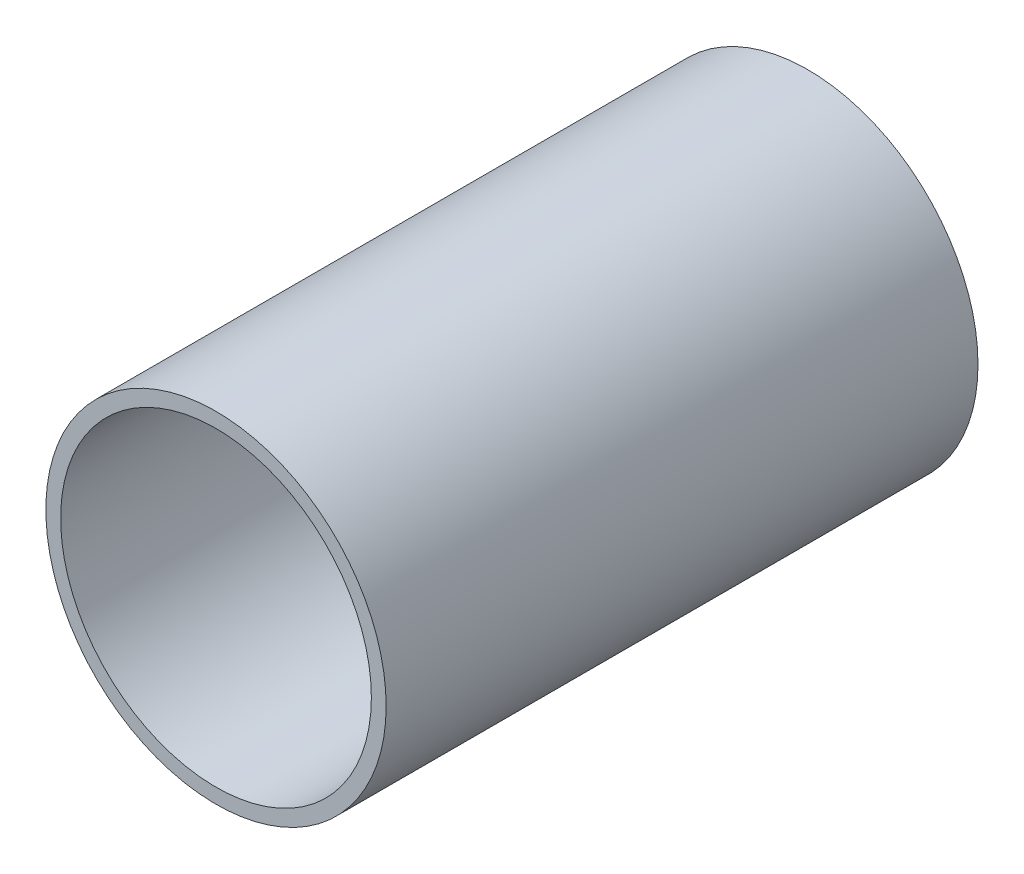
ISO-10303-21;
HEADER;
FILE_DESCRIPTION(('STEP AP214'),'2;1');
FILE_NAME('part.step','',(''),(''),'','','');
FILE_SCHEMA(('AUTOMOTIVE_DESIGN { 1 0 10303 214 1 1 1 1 }'));
ENDSEC;
DATA;
#1=APPLICATION_CONTEXT('core data for automotive mechanical design processes');
#2=APPLICATION_PROTOCOL_DEFINITION('international standard','automotive_design',2000,#1);
#3=PRODUCT_CONTEXT('',#1,'mechanical');
#4=PRODUCT('Part','Part','',(#3));
#5=PRODUCT_RELATED_PRODUCT_CATEGORY('part','',(#4));
#6=PRODUCT_DEFINITION_FORMATION('','',#4);
#7=PRODUCT_DEFINITION_CONTEXT('part definition',#1,'design');
#8=PRODUCT_DEFINITION('design','',#6,#7);
#9=PRODUCT_DEFINITION_SHAPE('','',#8);
#10=(LENGTH_UNIT() NAMED_UNIT(*) SI_UNIT(.MILLI.,.METRE.));
#11=(NAMED_UNIT(*) PLANE_ANGLE_UNIT() SI_UNIT($,.RADIAN.));
#12=(NAMED_UNIT(*) SI_UNIT($,.STERADIAN.) SOLID_ANGLE_UNIT());
#13=UNCERTAINTY_MEASURE_WITH_UNIT(LENGTH_MEASURE(1.E-05),#10,'distance_accuracy_value','');
#14=(GEOMETRIC_REPRESENTATION_CONTEXT(3) GLOBAL_UNCERTAINTY_ASSIGNED_CONTEXT((#13)) GLOBAL_UNIT_ASSIGNED_CONTEXT((#10,
#11,#12)) REPRESENTATION_CONTEXT('',''));
#15=CARTESIAN_POINT('',(0.,0.,0.));
#16=DIRECTION('',(0.,0.,1.));
#17=DIRECTION('',(1.,0.,0.));
#18=AXIS2_PLACEMENT_3D('',#15,#16,#17);
#19=CARTESIAN_POINT('',(0.,0.,50.8));
#20=DIRECTION('',(0.,0.,1.));
#21=DIRECTION('',(1.,0.,0.));
#22=AXIS2_PLACEMENT_3D('',#19,#20,#21);
#23=PLANE('',#22);
#24=CARTESIAN_POINT('',(0.,0.,50.8));
#25=DIRECTION('',(0.,0.,1.));
#26=DIRECTION('',(1.,0.,0.));
#27=AXIS2_PLACEMENT_3D('',#24,#25,#26);
#28=CIRCLE('',#27,29.21);
#29=CARTESIAN_POINT('',(29.21,0.,50.8));
#30=VERTEX_POINT('',#29);
#31=EDGE_CURVE('E10',#30,#30,#28,.T.);
#32=ORIENTED_EDGE('',*,*,#31,.T.);
#33=EDGE_LOOP('',(#32));
#34=FACE_BOUND('',#33,.T.);
#35=CARTESIAN_POINT('',(0.,0.,50.8));
#36=DIRECTION('',(0.,0.,1.));
#37=DIRECTION('',(1.,0.,0.));
#38=AXIS2_PLACEMENT_3D('',#35,#36,#37);
#39=CIRCLE('',#38,26.67);
#40=CARTESIAN_POINT('',(26.67,0.,50.8));
#41=VERTEX_POINT('',#40);
#42=EDGE_CURVE('E53',#41,#41,#39,.T.);
#43=ORIENTED_EDGE('',*,*,#42,.F.);
#44=EDGE_LOOP('',(#43));
#45=FACE_BOUND('',#44,.T.);
#46=ADVANCED_FACE('F39',(#34,#45),#23,.T.);
#47=CARTESIAN_POINT('',(0.,0.,-50.8));
#48=DIRECTION('',(0.,0.,1.));
#49=DIRECTION('',(1.,0.,0.));
#50=AXIS2_PLACEMENT_3D('',#47,#48,#49);
#51=PLANE('',#50);
#52=CARTESIAN_POINT('',(0.,0.,-50.8));
#53=DIRECTION('',(0.,0.,1.));
#54=DIRECTION('',(1.,0.,0.));
#55=AXIS2_PLACEMENT_3D('',#52,#53,#54);
#56=CIRCLE('',#55,29.21);
#57=CARTESIAN_POINT('',(29.21,0.,-50.8));
#58=VERTEX_POINT('',#57);
#59=EDGE_CURVE('E43',#58,#58,#56,.T.);
#60=ORIENTED_EDGE('',*,*,#59,.F.);
#61=EDGE_LOOP('',(#60));
#62=FACE_BOUND('',#61,.T.);
#63=CARTESIAN_POINT('',(0.,0.,-50.8));
#64=DIRECTION('',(0.,0.,1.));
#65=DIRECTION('',(1.,0.,0.));
#66=AXIS2_PLACEMENT_3D('',#63,#64,#65);
#67=CIRCLE('',#66,26.67);
#68=CARTESIAN_POINT('',(26.67,0.,-50.8));
#69=VERTEX_POINT('',#68);
#70=EDGE_CURVE('E55',#69,#69,#67,.T.);
#71=ORIENTED_EDGE('',*,*,#70,.T.);
#72=EDGE_LOOP('',(#71));
#73=FACE_BOUND('',#72,.T.);
#74=ADVANCED_FACE('F68',(#62,#73),#51,.F.);
#75=CARTESIAN_POINT('',(0.,0.,50.8));
#76=DIRECTION('',(0.,0.,-1.));
#77=DIRECTION('',(-1.,0.,0.));
#78=AXIS2_PLACEMENT_3D('',#75,#76,#77);
#79=CYLINDRICAL_SURFACE('',#78,29.21);
#80=ORIENTED_EDGE('',*,*,#31,.F.);
#81=EDGE_LOOP('',(#80));
#82=FACE_BOUND('',#81,.T.);
#83=ORIENTED_EDGE('',*,*,#59,.T.);
#84=EDGE_LOOP('',(#83));
#85=FACE_BOUND('',#84,.T.);
#86=ADVANCED_FACE('F41',(#82,#85),#79,.T.);
#87=CARTESIAN_POINT('',(0.,0.,50.8));
#88=DIRECTION('',(0.,0.,-1.));
#89=DIRECTION('',(-1.,0.,0.));
#90=AXIS2_PLACEMENT_3D('',#87,#88,#89);
#91=CYLINDRICAL_SURFACE('',#90,26.67);
#92=ORIENTED_EDGE('',*,*,#42,.T.);
#93=EDGE_LOOP('',(#92));
#94=FACE_BOUND('',#93,.T.);
#95=ORIENTED_EDGE('',*,*,#70,.F.);
#96=EDGE_LOOP('',(#95));
#97=FACE_BOUND('',#96,.T.);
#98=ADVANCED_FACE('F64',(#94,#97),#91,.F.);
#99=CLOSED_SHELL('',(#46,#74,#86,#98));
#100=MANIFOLD_SOLID_BREP('B2',#99);
#101=ADVANCED_BREP_SHAPE_REPRESENTATION('',(#18,#100),#14);
#102=SHAPE_DEFINITION_REPRESENTATION(#9,#101);
ENDSEC;
END-ISO-10303-21;
